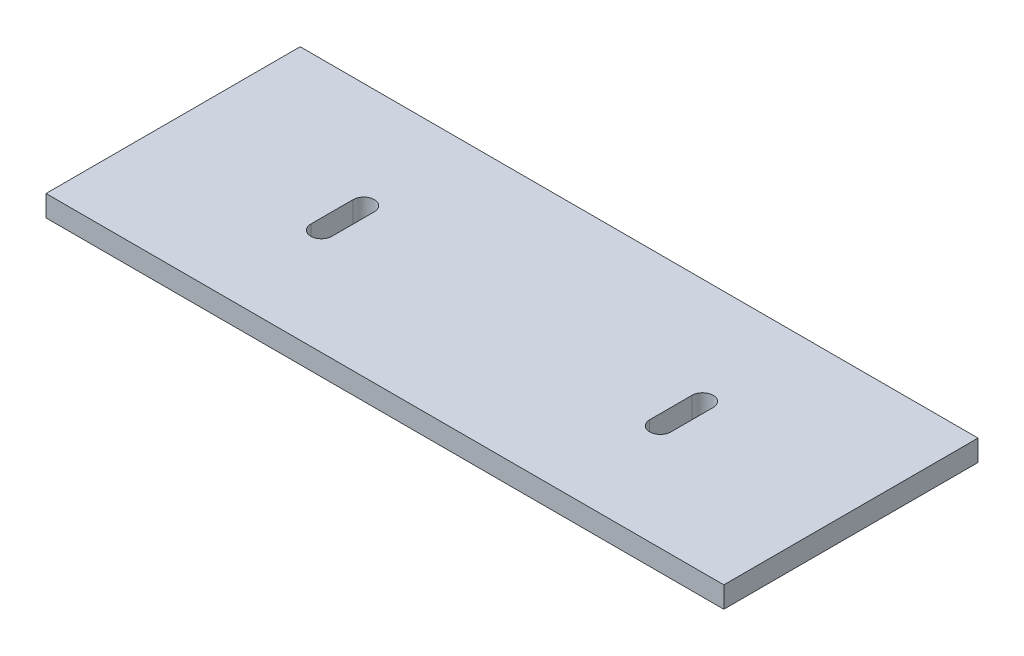
ISO-10303-21;
HEADER;
FILE_DESCRIPTION(('STEP AP214'),'2;1');
FILE_NAME('part.step','',(''),(''),'','','');
FILE_SCHEMA(('AUTOMOTIVE_DESIGN { 1 0 10303 214 1 1 1 1 }'));
ENDSEC;
DATA;
#1=APPLICATION_CONTEXT('core data for automotive mechanical design processes');
#2=APPLICATION_PROTOCOL_DEFINITION('international standard','automotive_design',2000,#1);
#3=PRODUCT_CONTEXT('',#1,'mechanical');
#4=PRODUCT('Part','Part','',(#3));
#5=PRODUCT_RELATED_PRODUCT_CATEGORY('part','',(#4));
#6=PRODUCT_DEFINITION_FORMATION('','',#4);
#7=PRODUCT_DEFINITION_CONTEXT('part definition',#1,'design');
#8=PRODUCT_DEFINITION('design','',#6,#7);
#9=PRODUCT_DEFINITION_SHAPE('','',#8);
#10=(LENGTH_UNIT() NAMED_UNIT(*) SI_UNIT(.MILLI.,.METRE.));
#11=(NAMED_UNIT(*) PLANE_ANGLE_UNIT() SI_UNIT($,.RADIAN.));
#12=(NAMED_UNIT(*) SI_UNIT($,.STERADIAN.) SOLID_ANGLE_UNIT());
#13=UNCERTAINTY_MEASURE_WITH_UNIT(LENGTH_MEASURE(1.E-05),#10,'distance_accuracy_value','');
#14=(GEOMETRIC_REPRESENTATION_CONTEXT(3) GLOBAL_UNCERTAINTY_ASSIGNED_CONTEXT((#13)) GLOBAL_UNIT_ASSIGNED_CONTEXT((#10,
#11,#12)) REPRESENTATION_CONTEXT('',''));
#15=CARTESIAN_POINT('',(0.,0.,0.));
#16=DIRECTION('',(0.,0.,1.));
#17=DIRECTION('',(1.,0.,0.));
#18=AXIS2_PLACEMENT_3D('',#15,#16,#17);
#19=CARTESIAN_POINT('',(0.,6.35,0.));
#20=DIRECTION('',(0.,-1.,0.));
#21=DIRECTION('',(0.,0.,-1.));
#22=AXIS2_PLACEMENT_3D('',#19,#20,#21);
#23=PLANE('',#22);
#24=CARTESIAN_POINT('',(-50.8,6.35,6.35));
#25=DIRECTION('',(0.,1.,0.));
#26=DIRECTION('',(0.,0.,1.));
#27=AXIS2_PLACEMENT_3D('',#24,#25,#26);
#28=CIRCLE('',#27,3.17500000000001);
#29=CARTESIAN_POINT('',(-53.975,6.35,6.35));
#30=VERTEX_POINT('',#29);
#31=CARTESIAN_POINT('',(-47.625,6.35,6.35));
#32=VERTEX_POINT('',#31);
#33=EDGE_CURVE('E164',#30,#32,#28,.T.);
#34=ORIENTED_EDGE('',*,*,#33,.F.);
#35=DIRECTION('',(0.,0.,1.));
#36=VECTOR('',#35,1.);
#37=CARTESIAN_POINT('',(-53.975,6.35,6.35));
#38=LINE('',#37,#36);
#39=CARTESIAN_POINT('',(-53.975,6.35,-6.35));
#40=VERTEX_POINT('',#39);
#41=EDGE_CURVE('E172',#40,#30,#38,.T.);
#42=ORIENTED_EDGE('',*,*,#41,.F.);
#43=CARTESIAN_POINT('',(-50.8,6.35,-6.35));
#44=DIRECTION('',(0.,1.,0.));
#45=DIRECTION('',(0.,0.,1.));
#46=AXIS2_PLACEMENT_3D('',#43,#44,#45);
#47=CIRCLE('',#46,3.17500000000001);
#48=CARTESIAN_POINT('',(-47.625,6.35,-6.35));
#49=VERTEX_POINT('',#48);
#50=EDGE_CURVE('E169',#49,#40,#47,.T.);
#51=ORIENTED_EDGE('',*,*,#50,.F.);
#52=DIRECTION('',(0.,0.,-1.));
#53=VECTOR('',#52,1.);
#54=CARTESIAN_POINT('',(-47.625,6.35,6.35));
#55=LINE('',#54,#53);
#56=EDGE_CURVE('E166',#32,#49,#55,.T.);
#57=ORIENTED_EDGE('',*,*,#56,.F.);
#58=EDGE_LOOP('',(#34,#42,#51,#57));
#59=FACE_BOUND('',#58,.T.);
#60=DIRECTION('',(0.,0.,-1.));
#61=VECTOR('',#60,1.);
#62=CARTESIAN_POINT('',(101.6,6.35,38.1));
#63=LINE('',#62,#61);
#64=CARTESIAN_POINT('',(101.6,6.35,38.1));
#65=VERTEX_POINT('',#64);
#66=CARTESIAN_POINT('',(101.6,6.35,-38.1));
#67=VERTEX_POINT('',#66);
#68=EDGE_CURVE('E195',#65,#67,#63,.T.);
#69=ORIENTED_EDGE('',*,*,#68,.T.);
#70=DIRECTION('',(-1.,0.,0.));
#71=VECTOR('',#70,1.);
#72=CARTESIAN_POINT('',(-101.6,6.35,-38.1));
#73=LINE('',#72,#71);
#74=CARTESIAN_POINT('',(-101.6,6.35,-38.1));
#75=VERTEX_POINT('',#74);
#76=EDGE_CURVE('E198',#67,#75,#73,.T.);
#77=ORIENTED_EDGE('',*,*,#76,.T.);
#78=DIRECTION('',(0.,0.,1.));
#79=VECTOR('',#78,1.);
#80=CARTESIAN_POINT('',(-101.6,6.35,38.1));
#81=LINE('',#80,#79);
#82=CARTESIAN_POINT('',(-101.6,6.35,38.1));
#83=VERTEX_POINT('',#82);
#84=EDGE_CURVE('E201',#75,#83,#81,.T.);
#85=ORIENTED_EDGE('',*,*,#84,.T.);
#86=DIRECTION('',(1.,0.,0.));
#87=VECTOR('',#86,1.);
#88=CARTESIAN_POINT('',(-101.6,6.35,38.1));
#89=LINE('',#88,#87);
#90=EDGE_CURVE('E203',#83,#65,#89,.T.);
#91=ORIENTED_EDGE('',*,*,#90,.T.);
#92=EDGE_LOOP('',(#69,#77,#85,#91));
#93=FACE_BOUND('',#92,.T.);
#94=CARTESIAN_POINT('',(50.8,6.35,6.35));
#95=DIRECTION('',(0.,1.,0.));
#96=DIRECTION('',(0.,0.,-1.));
#97=AXIS2_PLACEMENT_3D('',#94,#95,#96);
#98=CIRCLE('',#97,3.17500000000001);
#99=CARTESIAN_POINT('',(47.625,6.35,6.35));
#100=VERTEX_POINT('',#99);
#101=CARTESIAN_POINT('',(53.975,6.35,6.35));
#102=VERTEX_POINT('',#101);
#103=EDGE_CURVE('E128',#100,#102,#98,.T.);
#104=ORIENTED_EDGE('',*,*,#103,.F.);
#105=DIRECTION('',(0.,0.,1.));
#106=VECTOR('',#105,1.);
#107=CARTESIAN_POINT('',(47.625,6.35,6.35));
#108=LINE('',#107,#106);
#109=CARTESIAN_POINT('',(47.625,6.35,-6.35));
#110=VERTEX_POINT('',#109);
#111=EDGE_CURVE('E150',#110,#100,#108,.T.);
#112=ORIENTED_EDGE('',*,*,#111,.F.);
#113=CARTESIAN_POINT('',(50.8,6.35,-6.35));
#114=DIRECTION('',(0.,1.,0.));
#115=DIRECTION('',(0.,0.,-1.));
#116=AXIS2_PLACEMENT_3D('',#113,#114,#115);
#117=CIRCLE('',#116,3.17500000000001);
#118=CARTESIAN_POINT('',(53.975,6.35,-6.35));
#119=VERTEX_POINT('',#118);
#120=EDGE_CURVE('E148',#119,#110,#117,.T.);
#121=ORIENTED_EDGE('',*,*,#120,.F.);
#122=DIRECTION('',(0.,0.,-1.));
#123=VECTOR('',#122,1.);
#124=CARTESIAN_POINT('',(53.975,6.35,6.35));
#125=LINE('',#124,#123);
#126=EDGE_CURVE('E136',#102,#119,#125,.T.);
#127=ORIENTED_EDGE('',*,*,#126,.F.);
#128=EDGE_LOOP('',(#104,#112,#121,#127));
#129=FACE_BOUND('',#128,.T.);
#130=ADVANCED_FACE('F39',(#59,#93,#129),#23,.F.);
#131=CARTESIAN_POINT('',(0.,0.,0.));
#132=DIRECTION('',(0.,-1.,0.));
#133=DIRECTION('',(0.,0.,-1.));
#134=AXIS2_PLACEMENT_3D('',#131,#132,#133);
#135=PLANE('',#134);
#136=DIRECTION('',(0.,0.,-1.));
#137=VECTOR('',#136,1.);
#138=CARTESIAN_POINT('',(101.6,0.,38.1));
#139=LINE('',#138,#137);
#140=CARTESIAN_POINT('',(101.6,0.,38.1));
#141=VERTEX_POINT('',#140);
#142=CARTESIAN_POINT('',(101.6,0.,-38.1));
#143=VERTEX_POINT('',#142);
#144=EDGE_CURVE('E194',#141,#143,#139,.T.);
#145=ORIENTED_EDGE('',*,*,#144,.F.);
#146=DIRECTION('',(1.,0.,0.));
#147=VECTOR('',#146,1.);
#148=CARTESIAN_POINT('',(-101.6,0.,38.1));
#149=LINE('',#148,#147);
#150=CARTESIAN_POINT('',(-101.6,0.,38.1));
#151=VERTEX_POINT('',#150);
#152=EDGE_CURVE('E199',#151,#141,#149,.T.);
#153=ORIENTED_EDGE('',*,*,#152,.F.);
#154=DIRECTION('',(0.,0.,1.));
#155=VECTOR('',#154,1.);
#156=CARTESIAN_POINT('',(-101.6,0.,38.1));
#157=LINE('',#156,#155);
#158=CARTESIAN_POINT('',(-101.6,0.,-38.1));
#159=VERTEX_POINT('',#158);
#160=EDGE_CURVE('E210',#159,#151,#157,.T.);
#161=ORIENTED_EDGE('',*,*,#160,.F.);
#162=DIRECTION('',(-1.,0.,0.));
#163=VECTOR('',#162,1.);
#164=CARTESIAN_POINT('',(-101.6,0.,-38.1));
#165=LINE('',#164,#163);
#166=EDGE_CURVE('E208',#143,#159,#165,.T.);
#167=ORIENTED_EDGE('',*,*,#166,.F.);
#168=EDGE_LOOP('',(#145,#153,#161,#167));
#169=FACE_BOUND('',#168,.T.);
#170=DIRECTION('',(0.,0.,1.));
#171=VECTOR('',#170,1.);
#172=CARTESIAN_POINT('',(-53.975,0.,6.35));
#173=LINE('',#172,#171);
#174=CARTESIAN_POINT('',(-53.975,0.,-6.35));
#175=VERTEX_POINT('',#174);
#176=CARTESIAN_POINT('',(-53.975,0.,6.35));
#177=VERTEX_POINT('',#176);
#178=EDGE_CURVE('E167',#175,#177,#173,.T.);
#179=ORIENTED_EDGE('',*,*,#178,.T.);
#180=CARTESIAN_POINT('',(-50.8,0.,6.35));
#181=DIRECTION('',(0.,1.,0.));
#182=DIRECTION('',(0.,0.,1.));
#183=AXIS2_PLACEMENT_3D('',#180,#181,#182);
#184=CIRCLE('',#183,3.17500000000001);
#185=CARTESIAN_POINT('',(-47.625,0.,6.35));
#186=VERTEX_POINT('',#185);
#187=EDGE_CURVE('E144',#177,#186,#184,.T.);
#188=ORIENTED_EDGE('',*,*,#187,.T.);
#189=DIRECTION('',(0.,0.,-1.));
#190=VECTOR('',#189,1.);
#191=CARTESIAN_POINT('',(-47.625,0.,6.35));
#192=LINE('',#191,#190);
#193=CARTESIAN_POINT('',(-47.625,0.,-6.35));
#194=VERTEX_POINT('',#193);
#195=EDGE_CURVE('E177',#186,#194,#192,.T.);
#196=ORIENTED_EDGE('',*,*,#195,.T.);
#197=CARTESIAN_POINT('',(-50.8,0.,-6.35));
#198=DIRECTION('',(0.,1.,0.));
#199=DIRECTION('',(0.,0.,1.));
#200=AXIS2_PLACEMENT_3D('',#197,#198,#199);
#201=CIRCLE('',#200,3.17500000000001);
#202=EDGE_CURVE('E180',#194,#175,#201,.T.);
#203=ORIENTED_EDGE('',*,*,#202,.T.);
#204=EDGE_LOOP('',(#179,#188,#196,#203));
#205=FACE_BOUND('',#204,.T.);
#206=DIRECTION('',(0.,0.,1.));
#207=VECTOR('',#206,1.);
#208=CARTESIAN_POINT('',(47.625,0.,6.35));
#209=LINE('',#208,#207);
#210=CARTESIAN_POINT('',(47.625,0.,-6.35));
#211=VERTEX_POINT('',#210);
#212=CARTESIAN_POINT('',(47.625,0.,6.35));
#213=VERTEX_POINT('',#212);
#214=EDGE_CURVE('E137',#211,#213,#209,.T.);
#215=ORIENTED_EDGE('',*,*,#214,.T.);
#216=CARTESIAN_POINT('',(50.8,0.,6.35));
#217=DIRECTION('',(0.,1.,0.));
#218=DIRECTION('',(0.,0.,-1.));
#219=AXIS2_PLACEMENT_3D('',#216,#217,#218);
#220=CIRCLE('',#219,3.17500000000001);
#221=CARTESIAN_POINT('',(53.975,0.,6.35));
#222=VERTEX_POINT('',#221);
#223=EDGE_CURVE('E62',#213,#222,#220,.T.);
#224=ORIENTED_EDGE('',*,*,#223,.T.);
#225=DIRECTION('',(0.,0.,-1.));
#226=VECTOR('',#225,1.);
#227=CARTESIAN_POINT('',(53.975,0.,6.35));
#228=LINE('',#227,#226);
#229=CARTESIAN_POINT('',(53.975,0.,-6.35));
#230=VERTEX_POINT('',#229);
#231=EDGE_CURVE('E143',#222,#230,#228,.T.);
#232=ORIENTED_EDGE('',*,*,#231,.T.);
#233=CARTESIAN_POINT('',(50.8,0.,-6.35));
#234=DIRECTION('',(0.,1.,0.));
#235=DIRECTION('',(0.,0.,-1.));
#236=AXIS2_PLACEMENT_3D('',#233,#234,#235);
#237=CIRCLE('',#236,3.17500000000001);
#238=EDGE_CURVE('E156',#230,#211,#237,.T.);
#239=ORIENTED_EDGE('',*,*,#238,.T.);
#240=EDGE_LOOP('',(#215,#224,#232,#239));
#241=FACE_BOUND('',#240,.T.);
#242=ADVANCED_FACE('F228',(#169,#205,#241),#135,.T.);
#243=CARTESIAN_POINT('',(101.6,6.35,38.1));
#244=DIRECTION('',(-1.,0.,0.));
#245=DIRECTION('',(0.,0.,1.));
#246=AXIS2_PLACEMENT_3D('',#243,#244,#245);
#247=PLANE('',#246);
#248=ORIENTED_EDGE('',*,*,#144,.T.);
#249=DIRECTION('',(0.,-1.,0.));
#250=VECTOR('',#249,1.);
#251=CARTESIAN_POINT('',(101.6,6.35,-38.1));
#252=LINE('',#251,#250);
#253=EDGE_CURVE('E11',#67,#143,#252,.T.);
#254=ORIENTED_EDGE('',*,*,#253,.F.);
#255=ORIENTED_EDGE('',*,*,#68,.F.);
#256=DIRECTION('',(0.,-1.,0.));
#257=VECTOR('',#256,1.);
#258=CARTESIAN_POINT('',(101.6,6.35,38.1));
#259=LINE('',#258,#257);
#260=EDGE_CURVE('E205',#65,#141,#259,.T.);
#261=ORIENTED_EDGE('',*,*,#260,.T.);
#262=EDGE_LOOP('',(#248,#254,#255,#261));
#263=FACE_BOUND('',#262,.T.);
#264=ADVANCED_FACE('F41',(#263),#247,.F.);
#265=CARTESIAN_POINT('',(-101.6,6.35,-38.1));
#266=DIRECTION('',(0.,0.,1.));
#267=DIRECTION('',(1.,0.,0.));
#268=AXIS2_PLACEMENT_3D('',#265,#266,#267);
#269=PLANE('',#268);
#270=ORIENTED_EDGE('',*,*,#166,.T.);
#271=DIRECTION('',(0.,-1.,0.));
#272=VECTOR('',#271,1.);
#273=CARTESIAN_POINT('',(-101.6,6.35,-38.1));
#274=LINE('',#273,#272);
#275=EDGE_CURVE('E47',#75,#159,#274,.T.);
#276=ORIENTED_EDGE('',*,*,#275,.F.);
#277=ORIENTED_EDGE('',*,*,#76,.F.);
#278=ORIENTED_EDGE('',*,*,#253,.T.);
#279=EDGE_LOOP('',(#270,#276,#277,#278));
#280=FACE_BOUND('',#279,.T.);
#281=ADVANCED_FACE('F238',(#280),#269,.F.);
#282=CARTESIAN_POINT('',(-101.6,6.35,38.1));
#283=DIRECTION('',(1.,0.,0.));
#284=DIRECTION('',(0.,0.,-1.));
#285=AXIS2_PLACEMENT_3D('',#282,#283,#284);
#286=PLANE('',#285);
#287=ORIENTED_EDGE('',*,*,#160,.T.);
#288=DIRECTION('',(0.,-1.,0.));
#289=VECTOR('',#288,1.);
#290=CARTESIAN_POINT('',(-101.6,6.35,38.1));
#291=LINE('',#290,#289);
#292=EDGE_CURVE('E215',#83,#151,#291,.T.);
#293=ORIENTED_EDGE('',*,*,#292,.F.);
#294=ORIENTED_EDGE('',*,*,#84,.F.);
#295=ORIENTED_EDGE('',*,*,#275,.T.);
#296=EDGE_LOOP('',(#287,#293,#294,#295));
#297=FACE_BOUND('',#296,.T.);
#298=ADVANCED_FACE('F222',(#297),#286,.F.);
#299=CARTESIAN_POINT('',(-101.6,6.35,38.1));
#300=DIRECTION('',(0.,0.,-1.));
#301=DIRECTION('',(-1.,0.,0.));
#302=AXIS2_PLACEMENT_3D('',#299,#300,#301);
#303=PLANE('',#302);
#304=ORIENTED_EDGE('',*,*,#152,.T.);
#305=ORIENTED_EDGE('',*,*,#260,.F.);
#306=ORIENTED_EDGE('',*,*,#90,.F.);
#307=ORIENTED_EDGE('',*,*,#292,.T.);
#308=EDGE_LOOP('',(#304,#305,#306,#307));
#309=FACE_BOUND('',#308,.T.);
#310=ADVANCED_FACE('F232',(#309),#303,.F.);
#311=CARTESIAN_POINT('',(-50.8,6.35,6.35));
#312=DIRECTION('',(0.,-1.,0.));
#313=DIRECTION('',(0.,0.,-1.));
#314=AXIS2_PLACEMENT_3D('',#311,#312,#313);
#315=CYLINDRICAL_SURFACE('',#314,3.17500000000001);
#316=ORIENTED_EDGE('',*,*,#187,.F.);
#317=DIRECTION('',(0.,-1.,0.));
#318=VECTOR('',#317,1.);
#319=CARTESIAN_POINT('',(-53.975,6.35,6.35));
#320=LINE('',#319,#318);
#321=EDGE_CURVE('E174',#30,#177,#320,.T.);
#322=ORIENTED_EDGE('',*,*,#321,.F.);
#323=ORIENTED_EDGE('',*,*,#33,.T.);
#324=DIRECTION('',(0.,-1.,0.));
#325=VECTOR('',#324,1.);
#326=CARTESIAN_POINT('',(-47.625,6.35,6.35));
#327=LINE('',#326,#325);
#328=EDGE_CURVE('E191',#32,#186,#327,.T.);
#329=ORIENTED_EDGE('',*,*,#328,.T.);
#330=EDGE_LOOP('',(#316,#322,#323,#329));
#331=FACE_BOUND('',#330,.T.);
#332=ADVANCED_FACE('F254',(#331),#315,.F.);
#333=CARTESIAN_POINT('',(-47.625,6.35,6.35));
#334=DIRECTION('',(-1.,0.,0.));
#335=DIRECTION('',(0.,0.,1.));
#336=AXIS2_PLACEMENT_3D('',#333,#334,#335);
#337=PLANE('',#336);
#338=ORIENTED_EDGE('',*,*,#195,.F.);
#339=ORIENTED_EDGE('',*,*,#328,.F.);
#340=ORIENTED_EDGE('',*,*,#56,.T.);
#341=DIRECTION('',(0.,-1.,0.));
#342=VECTOR('',#341,1.);
#343=CARTESIAN_POINT('',(-47.625,6.35,-6.35));
#344=LINE('',#343,#342);
#345=EDGE_CURVE('E189',#49,#194,#344,.T.);
#346=ORIENTED_EDGE('',*,*,#345,.T.);
#347=EDGE_LOOP('',(#338,#339,#340,#346));
#348=FACE_BOUND('',#347,.T.);
#349=ADVANCED_FACE('F261',(#348),#337,.T.);
#350=CARTESIAN_POINT('',(-50.8,6.35,-6.35));
#351=DIRECTION('',(0.,-1.,0.));
#352=DIRECTION('',(0.,0.,-1.));
#353=AXIS2_PLACEMENT_3D('',#350,#351,#352);
#354=CYLINDRICAL_SURFACE('',#353,3.17500000000001);
#355=ORIENTED_EDGE('',*,*,#202,.F.);
#356=ORIENTED_EDGE('',*,*,#345,.F.);
#357=ORIENTED_EDGE('',*,*,#50,.T.);
#358=DIRECTION('',(0.,-1.,0.));
#359=VECTOR('',#358,1.);
#360=CARTESIAN_POINT('',(-53.975,6.35,-6.35));
#361=LINE('',#360,#359);
#362=EDGE_CURVE('E187',#40,#175,#361,.T.);
#363=ORIENTED_EDGE('',*,*,#362,.T.);
#364=EDGE_LOOP('',(#355,#356,#357,#363));
#365=FACE_BOUND('',#364,.T.);
#366=ADVANCED_FACE('F266',(#365),#354,.F.);
#367=CARTESIAN_POINT('',(-53.975,6.35,6.35));
#368=DIRECTION('',(1.,0.,0.));
#369=DIRECTION('',(0.,0.,-1.));
#370=AXIS2_PLACEMENT_3D('',#367,#368,#369);
#371=PLANE('',#370);
#372=ORIENTED_EDGE('',*,*,#178,.F.);
#373=ORIENTED_EDGE('',*,*,#362,.F.);
#374=ORIENTED_EDGE('',*,*,#41,.T.);
#375=ORIENTED_EDGE('',*,*,#321,.T.);
#376=EDGE_LOOP('',(#372,#373,#374,#375));
#377=FACE_BOUND('',#376,.T.);
#378=ADVANCED_FACE('F272',(#377),#371,.T.);
#379=CARTESIAN_POINT('',(50.8,6.35,6.35));
#380=DIRECTION('',(0.,-1.,0.));
#381=DIRECTION('',(0.,0.,-1.));
#382=AXIS2_PLACEMENT_3D('',#379,#380,#381);
#383=CYLINDRICAL_SURFACE('',#382,3.17500000000001);
#384=ORIENTED_EDGE('',*,*,#223,.F.);
#385=DIRECTION('',(0.,-1.,0.));
#386=VECTOR('',#385,1.);
#387=CARTESIAN_POINT('',(47.625,6.35,6.35));
#388=LINE('',#387,#386);
#389=EDGE_CURVE('E132',#100,#213,#388,.T.);
#390=ORIENTED_EDGE('',*,*,#389,.F.);
#391=ORIENTED_EDGE('',*,*,#103,.T.);
#392=DIRECTION('',(0.,-1.,0.));
#393=VECTOR('',#392,1.);
#394=CARTESIAN_POINT('',(53.975,6.35,6.35));
#395=LINE('',#394,#393);
#396=EDGE_CURVE('E131',#102,#222,#395,.T.);
#397=ORIENTED_EDGE('',*,*,#396,.T.);
#398=EDGE_LOOP('',(#384,#390,#391,#397));
#399=FACE_BOUND('',#398,.T.);
#400=ADVANCED_FACE('F130',(#399),#383,.F.);
#401=CARTESIAN_POINT('',(53.975,6.35,6.35));
#402=DIRECTION('',(-1.,0.,0.));
#403=DIRECTION('',(0.,0.,1.));
#404=AXIS2_PLACEMENT_3D('',#401,#402,#403);
#405=PLANE('',#404);
#406=ORIENTED_EDGE('',*,*,#231,.F.);
#407=ORIENTED_EDGE('',*,*,#396,.F.);
#408=ORIENTED_EDGE('',*,*,#126,.T.);
#409=DIRECTION('',(0.,-1.,0.));
#410=VECTOR('',#409,1.);
#411=CARTESIAN_POINT('',(53.975,6.35,-6.35));
#412=LINE('',#411,#410);
#413=EDGE_CURVE('E145',#119,#230,#412,.T.);
#414=ORIENTED_EDGE('',*,*,#413,.T.);
#415=EDGE_LOOP('',(#406,#407,#408,#414));
#416=FACE_BOUND('',#415,.T.);
#417=ADVANCED_FACE('F140',(#416),#405,.T.);
#418=CARTESIAN_POINT('',(50.8,6.35,-6.35));
#419=DIRECTION('',(0.,-1.,0.));
#420=DIRECTION('',(0.,0.,-1.));
#421=AXIS2_PLACEMENT_3D('',#418,#419,#420);
#422=CYLINDRICAL_SURFACE('',#421,3.17500000000001);
#423=ORIENTED_EDGE('',*,*,#238,.F.);
#424=ORIENTED_EDGE('',*,*,#413,.F.);
#425=ORIENTED_EDGE('',*,*,#120,.T.);
#426=DIRECTION('',(0.,-1.,0.));
#427=VECTOR('',#426,1.);
#428=CARTESIAN_POINT('',(47.625,6.35,-6.35));
#429=LINE('',#428,#427);
#430=EDGE_CURVE('E54',#110,#211,#429,.T.);
#431=ORIENTED_EDGE('',*,*,#430,.T.);
#432=EDGE_LOOP('',(#423,#424,#425,#431));
#433=FACE_BOUND('',#432,.T.);
#434=ADVANCED_FACE('F291',(#433),#422,.F.);
#435=CARTESIAN_POINT('',(47.625,6.35,6.35));
#436=DIRECTION('',(1.,0.,0.));
#437=DIRECTION('',(0.,0.,-1.));
#438=AXIS2_PLACEMENT_3D('',#435,#436,#437);
#439=PLANE('',#438);
#440=ORIENTED_EDGE('',*,*,#214,.F.);
#441=ORIENTED_EDGE('',*,*,#430,.F.);
#442=ORIENTED_EDGE('',*,*,#111,.T.);
#443=ORIENTED_EDGE('',*,*,#389,.T.);
#444=EDGE_LOOP('',(#440,#441,#442,#443));
#445=FACE_BOUND('',#444,.T.);
#446=ADVANCED_FACE('F294',(#445),#439,.T.);
#447=CLOSED_SHELL('',(#130,#242,#264,#281,#298,#310,#332,#349,#366,#378,#400,#417,#434,#446));
#448=MANIFOLD_SOLID_BREP('B2',#447);
#449=ADVANCED_BREP_SHAPE_REPRESENTATION('',(#18,#448),#14);
#450=SHAPE_DEFINITION_REPRESENTATION(#9,#449);
ENDSEC;
END-ISO-10303-21;
